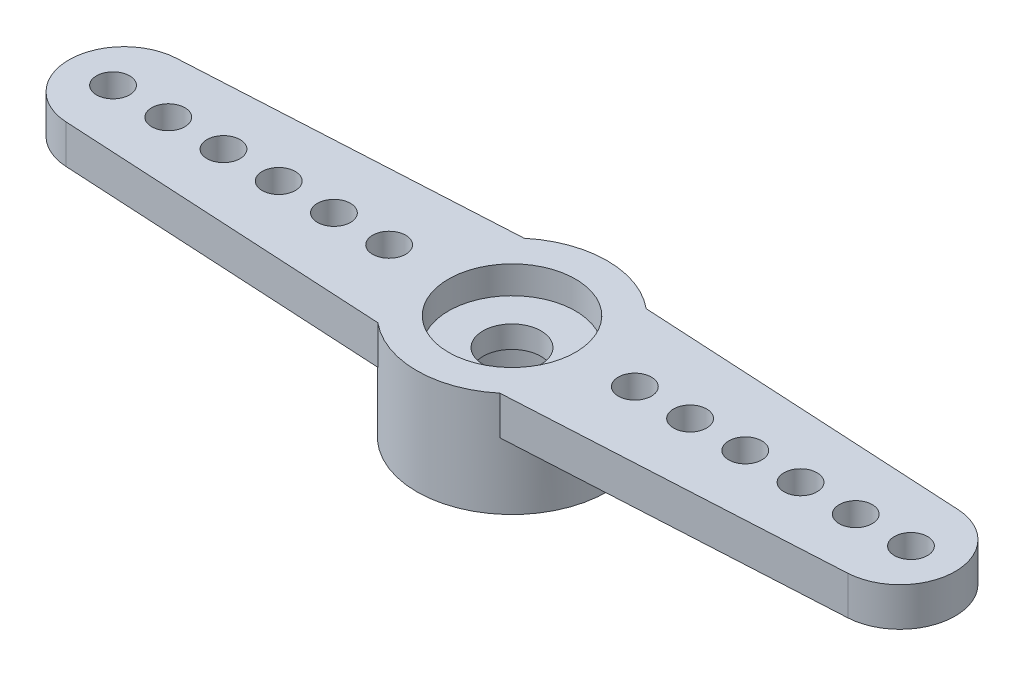
ISO-10303-21;
HEADER;
FILE_DESCRIPTION(('STEP AP214'),'2;1');
FILE_NAME('part.step','',(''),(''),'','','');
FILE_SCHEMA(('AUTOMOTIVE_DESIGN { 1 0 10303 214 1 1 1 1 }'));
ENDSEC;
DATA;
#1=APPLICATION_CONTEXT('core data for automotive mechanical design processes');
#2=APPLICATION_PROTOCOL_DEFINITION('international standard','automotive_design',2000,#1);
#3=PRODUCT_CONTEXT('',#1,'mechanical');
#4=PRODUCT('Part','Part','',(#3));
#5=PRODUCT_RELATED_PRODUCT_CATEGORY('part','',(#4));
#6=PRODUCT_DEFINITION_FORMATION('','',#4);
#7=PRODUCT_DEFINITION_CONTEXT('part definition',#1,'design');
#8=PRODUCT_DEFINITION('design','',#6,#7);
#9=PRODUCT_DEFINITION_SHAPE('','',#8);
#10=(LENGTH_UNIT() NAMED_UNIT(*) SI_UNIT(.MILLI.,.METRE.));
#11=(NAMED_UNIT(*) PLANE_ANGLE_UNIT() SI_UNIT($,.RADIAN.));
#12=(NAMED_UNIT(*) SI_UNIT($,.STERADIAN.) SOLID_ANGLE_UNIT());
#13=UNCERTAINTY_MEASURE_WITH_UNIT(LENGTH_MEASURE(1.E-05),#10,'distance_accuracy_value','');
#14=(GEOMETRIC_REPRESENTATION_CONTEXT(3) GLOBAL_UNCERTAINTY_ASSIGNED_CONTEXT((#13)) GLOBAL_UNIT_ASSIGNED_CONTEXT((#10,
#11,#12)) REPRESENTATION_CONTEXT('',''));
#15=CARTESIAN_POINT('',(0.,0.,0.));
#16=DIRECTION('',(0.,0.,1.));
#17=DIRECTION('',(1.,0.,0.));
#18=AXIS2_PLACEMENT_3D('',#15,#16,#17);
#19=CARTESIAN_POINT('',(0.,-1.4,0.));
#20=DIRECTION('',(0.,1.,0.));
#21=DIRECTION('',(0.,0.,1.));
#22=AXIS2_PLACEMENT_3D('',#19,#20,#21);
#23=PLANE('',#22);
#24=CARTESIAN_POINT('',(-12.45,-1.4,0.));
#25=DIRECTION('',(0.,1.,0.));
#26=DIRECTION('',(0.,0.,1.));
#27=AXIS2_PLACEMENT_3D('',#24,#25,#26);
#28=CIRCLE('',#27,0.600000000000014);
#29=CARTESIAN_POINT('',(-12.45,-1.4,0.600000000000014));
#30=VERTEX_POINT('',#29);
#31=EDGE_CURVE('E154',#30,#30,#28,.T.);
#32=ORIENTED_EDGE('',*,*,#31,.T.);
#33=EDGE_LOOP('',(#32));
#34=FACE_BOUND('',#33,.T.);
#35=CARTESIAN_POINT('',(-14.45,-1.4,0.));
#36=DIRECTION('',(0.,1.,0.));
#37=DIRECTION('',(0.,0.,1.));
#38=AXIS2_PLACEMENT_3D('',#35,#36,#37);
#39=CIRCLE('',#38,0.600000000000014);
#40=CARTESIAN_POINT('',(-14.45,-1.4,0.600000000000014));
#41=VERTEX_POINT('',#40);
#42=EDGE_CURVE('E167',#41,#41,#39,.T.);
#43=ORIENTED_EDGE('',*,*,#42,.T.);
#44=EDGE_LOOP('',(#43));
#45=FACE_BOUND('',#44,.T.);
#46=CARTESIAN_POINT('',(0.,-1.4,0.));
#47=DIRECTION('',(0.,-1.,0.));
#48=DIRECTION('',(0.,0.,-1.));
#49=AXIS2_PLACEMENT_3D('',#46,#47,#48);
#50=CIRCLE('',#49,3.45);
#51=CARTESIAN_POINT('',(-2.20907220343745,-1.4,2.65));
#52=VERTEX_POINT('',#51);
#53=CARTESIAN_POINT('',(-2.20907220343745,-1.4,-2.65));
#54=VERTEX_POINT('',#53);
#55=EDGE_CURVE('E94',#52,#54,#50,.T.);
#56=ORIENTED_EDGE('',*,*,#55,.F.);
#57=DIRECTION('',(0.998510440144325,0.,0.0545609835210727));
#58=VECTOR('',#57,1.);
#59=CARTESIAN_POINT('',(-2.20907220343745,-1.4,2.65));
#60=LINE('',#59,#58);
#61=CARTESIAN_POINT('',(-14.1591219670421,-1.4,1.99702088028865));
#62=VERTEX_POINT('',#61);
#63=EDGE_CURVE('E186',#62,#52,#60,.T.);
#64=ORIENTED_EDGE('',*,*,#63,.F.);
#65=CARTESIAN_POINT('',(-14.05,-1.4,0.));
#66=DIRECTION('',(0.,1.,0.));
#67=DIRECTION('',(0.,0.,1.));
#68=AXIS2_PLACEMENT_3D('',#65,#66,#67);
#69=CIRCLE('',#68,2.);
#70=CARTESIAN_POINT('',(-14.1591219670421,-1.4,-1.99702088028865));
#71=VERTEX_POINT('',#70);
#72=EDGE_CURVE('E182',#71,#62,#69,.T.);
#73=ORIENTED_EDGE('',*,*,#72,.F.);
#74=DIRECTION('',(-0.998510440144325,0.,0.0545609835210729));
#75=VECTOR('',#74,1.);
#76=CARTESIAN_POINT('',(-14.1591219670421,-1.4,-1.99702088028865));
#77=LINE('',#76,#75);
#78=EDGE_CURVE('E178',#54,#71,#77,.T.);
#79=ORIENTED_EDGE('',*,*,#78,.F.);
#80=EDGE_LOOP('',(#56,#64,#73,#79));
#81=FACE_BOUND('',#80,.T.);
#82=CARTESIAN_POINT('',(-10.45,-1.4,0.));
#83=DIRECTION('',(0.,1.,0.));
#84=DIRECTION('',(0.,0.,1.));
#85=AXIS2_PLACEMENT_3D('',#82,#83,#84);
#86=CIRCLE('',#85,0.600000000000014);
#87=CARTESIAN_POINT('',(-10.45,-1.4,0.600000000000014));
#88=VERTEX_POINT('',#87);
#89=EDGE_CURVE('E217',#88,#88,#86,.T.);
#90=ORIENTED_EDGE('',*,*,#89,.T.);
#91=EDGE_LOOP('',(#90));
#92=FACE_BOUND('',#91,.T.);
#93=CARTESIAN_POINT('',(-8.45,-1.4,0.));
#94=DIRECTION('',(0.,1.,0.));
#95=DIRECTION('',(0.,0.,1.));
#96=AXIS2_PLACEMENT_3D('',#93,#94,#95);
#97=CIRCLE('',#96,0.600000000000014);
#98=CARTESIAN_POINT('',(-8.45,-1.4,0.600000000000014));
#99=VERTEX_POINT('',#98);
#100=EDGE_CURVE('E225',#99,#99,#97,.T.);
#101=ORIENTED_EDGE('',*,*,#100,.T.);
#102=EDGE_LOOP('',(#101));
#103=FACE_BOUND('',#102,.T.);
#104=CARTESIAN_POINT('',(-6.45,-1.4,0.));
#105=DIRECTION('',(0.,1.,0.));
#106=DIRECTION('',(0.,0.,1.));
#107=AXIS2_PLACEMENT_3D('',#104,#105,#106);
#108=CIRCLE('',#107,0.600000000000014);
#109=CARTESIAN_POINT('',(-6.45,-1.4,0.600000000000014));
#110=VERTEX_POINT('',#109);
#111=EDGE_CURVE('E233',#110,#110,#108,.T.);
#112=ORIENTED_EDGE('',*,*,#111,.T.);
#113=EDGE_LOOP('',(#112));
#114=FACE_BOUND('',#113,.T.);
#115=CARTESIAN_POINT('',(-4.45,-1.4,0.));
#116=DIRECTION('',(0.,1.,0.));
#117=DIRECTION('',(0.,0.,1.));
#118=AXIS2_PLACEMENT_3D('',#115,#116,#117);
#119=CIRCLE('',#118,0.600000000000014);
#120=CARTESIAN_POINT('',(-4.45,-1.4,0.600000000000014));
#121=VERTEX_POINT('',#120);
#122=EDGE_CURVE('E12',#121,#121,#119,.T.);
#123=ORIENTED_EDGE('',*,*,#122,.T.);
#124=EDGE_LOOP('',(#123));
#125=FACE_BOUND('',#124,.T.);
#126=ADVANCED_FACE('F45',(#34,#45,#81,#92,#103,#114,#125),#23,.F.);
#127=CARTESIAN_POINT('',(0.,-1.4,0.));
#128=DIRECTION('',(0.,1.,0.));
#129=DIRECTION('',(0.,0.,1.));
#130=AXIS2_PLACEMENT_3D('',#127,#128,#129);
#131=CYLINDRICAL_SURFACE('',#130,3.45);
#132=DIRECTION('',(0.,1.,0.));
#133=VECTOR('',#132,1.);
#134=CARTESIAN_POINT('',(-2.20907220343745,-1.4,2.65));
#135=LINE('',#134,#133);
#136=CARTESIAN_POINT('',(-2.20907220343745,0.,2.65));
#137=VERTEX_POINT('',#136);
#138=EDGE_CURVE('E88',#52,#137,#135,.T.);
#139=ORIENTED_EDGE('',*,*,#138,.F.);
#140=ORIENTED_EDGE('',*,*,#55,.T.);
#141=DIRECTION('',(0.,1.,0.));
#142=VECTOR('',#141,1.);
#143=CARTESIAN_POINT('',(-2.20907220343745,-1.4,-2.65));
#144=LINE('',#143,#142);
#145=CARTESIAN_POINT('',(-2.20907220343745,0.,-2.65));
#146=VERTEX_POINT('',#145);
#147=EDGE_CURVE('E189',#54,#146,#144,.T.);
#148=ORIENTED_EDGE('',*,*,#147,.T.);
#149=CARTESIAN_POINT('',(0.,0.,0.));
#150=DIRECTION('',(0.,1.,0.));
#151=DIRECTION('',(0.,0.,1.));
#152=AXIS2_PLACEMENT_3D('',#149,#150,#151);
#153=CIRCLE('',#152,3.45);
#154=CARTESIAN_POINT('',(2.20907220343745,0.,-2.65));
#155=VERTEX_POINT('',#154);
#156=EDGE_CURVE('E177',#155,#146,#153,.T.);
#157=ORIENTED_EDGE('',*,*,#156,.F.);
#158=DIRECTION('',(0.,1.,0.));
#159=VECTOR('',#158,1.);
#160=CARTESIAN_POINT('',(2.20907220343745,-1.4,-2.65));
#161=LINE('',#160,#159);
#162=CARTESIAN_POINT('',(2.20907220343745,-1.4,-2.65));
#163=VERTEX_POINT('',#162);
#164=EDGE_CURVE('E147',#163,#155,#161,.T.);
#165=ORIENTED_EDGE('',*,*,#164,.F.);
#166=CARTESIAN_POINT('',(0.,-1.4,0.));
#167=DIRECTION('',(0.,1.,0.));
#168=DIRECTION('',(0.,0.,1.));
#169=AXIS2_PLACEMENT_3D('',#166,#167,#168);
#170=CIRCLE('',#169,3.45);
#171=CARTESIAN_POINT('',(2.20907220343745,-1.4,2.65));
#172=VERTEX_POINT('',#171);
#173=EDGE_CURVE('E137',#163,#172,#170,.F.);
#174=ORIENTED_EDGE('',*,*,#173,.T.);
#175=DIRECTION('',(0.,1.,0.));
#176=VECTOR('',#175,1.);
#177=CARTESIAN_POINT('',(2.20907220343745,-1.4,2.65));
#178=LINE('',#177,#176);
#179=CARTESIAN_POINT('',(2.20907220343745,0.,2.65));
#180=VERTEX_POINT('',#179);
#181=EDGE_CURVE('E121',#172,#180,#178,.T.);
#182=ORIENTED_EDGE('',*,*,#181,.T.);
#183=EDGE_CURVE('E190',#137,#180,#153,.T.);
#184=ORIENTED_EDGE('',*,*,#183,.F.);
#185=EDGE_LOOP('',(#139,#140,#148,#157,#165,#174,#182,#184));
#186=FACE_BOUND('',#185,.T.);
#187=CARTESIAN_POINT('',(0.,-3.8,0.));
#188=DIRECTION('',(0.,1.,0.));
#189=DIRECTION('',(0.,0.,1.));
#190=AXIS2_PLACEMENT_3D('',#187,#188,#189);
#191=CIRCLE('',#190,3.45);
#192=CARTESIAN_POINT('',(0.,-3.8,3.45));
#193=VERTEX_POINT('',#192);
#194=EDGE_CURVE('E173',#193,#193,#191,.T.);
#195=ORIENTED_EDGE('',*,*,#194,.T.);
#196=EDGE_LOOP('',(#195));
#197=FACE_BOUND('',#196,.T.);
#198=ADVANCED_FACE('F144',(#186,#197),#131,.T.);
#199=CARTESIAN_POINT('',(-2.20907220343745,-1.4,2.65));
#200=DIRECTION('',(-0.0545609835210727,0.,0.998510440144325));
#201=DIRECTION('',(0.998510440144325,0.,0.0545609835210727));
#202=AXIS2_PLACEMENT_3D('',#199,#200,#201);
#203=PLANE('',#202);
#204=DIRECTION('',(0.998510440144325,0.,0.0545609835210727));
#205=VECTOR('',#204,1.);
#206=CARTESIAN_POINT('',(-2.20907220343745,0.,2.65));
#207=LINE('',#206,#205);
#208=CARTESIAN_POINT('',(-14.1591219670421,0.,1.99702088028865));
#209=VERTEX_POINT('',#208);
#210=EDGE_CURVE('E183',#209,#137,#207,.T.);
#211=ORIENTED_EDGE('',*,*,#210,.F.);
#212=DIRECTION('',(0.,1.,0.));
#213=VECTOR('',#212,1.);
#214=CARTESIAN_POINT('',(-14.1591219670421,-1.4,1.99702088028865));
#215=LINE('',#214,#213);
#216=EDGE_CURVE('E71',#62,#209,#215,.T.);
#217=ORIENTED_EDGE('',*,*,#216,.F.);
#218=ORIENTED_EDGE('',*,*,#63,.T.);
#219=ORIENTED_EDGE('',*,*,#138,.T.);
#220=EDGE_LOOP('',(#211,#217,#218,#219));
#221=FACE_BOUND('',#220,.T.);
#222=ADVANCED_FACE('F272',(#221),#203,.T.);
#223=CARTESIAN_POINT('',(-14.05,-1.4,0.));
#224=DIRECTION('',(0.,1.,0.));
#225=DIRECTION('',(0.,0.,1.));
#226=AXIS2_PLACEMENT_3D('',#223,#224,#225);
#227=CYLINDRICAL_SURFACE('',#226,2.);
#228=CARTESIAN_POINT('',(-14.05,0.,0.));
#229=DIRECTION('',(0.,1.,0.));
#230=DIRECTION('',(0.,0.,1.));
#231=AXIS2_PLACEMENT_3D('',#228,#229,#230);
#232=CIRCLE('',#231,2.);
#233=CARTESIAN_POINT('',(-14.1591219670421,0.,-1.99702088028865));
#234=VERTEX_POINT('',#233);
#235=EDGE_CURVE('E197',#234,#209,#232,.T.);
#236=ORIENTED_EDGE('',*,*,#235,.F.);
#237=DIRECTION('',(0.,1.,0.));
#238=VECTOR('',#237,1.);
#239=CARTESIAN_POINT('',(-14.1591219670421,-1.4,-1.99702088028865));
#240=LINE('',#239,#238);
#241=EDGE_CURVE('E209',#71,#234,#240,.T.);
#242=ORIENTED_EDGE('',*,*,#241,.F.);
#243=ORIENTED_EDGE('',*,*,#72,.T.);
#244=ORIENTED_EDGE('',*,*,#216,.T.);
#245=EDGE_LOOP('',(#236,#242,#243,#244));
#246=FACE_BOUND('',#245,.T.);
#247=ADVANCED_FACE('F258',(#246),#227,.T.);
#248=CARTESIAN_POINT('',(-14.1591219670421,-1.4,-1.99702088028865));
#249=DIRECTION('',(-0.0545609835210729,0.,-0.998510440144325));
#250=DIRECTION('',(-0.998510440144325,0.,0.0545609835210729));
#251=AXIS2_PLACEMENT_3D('',#248,#249,#250);
#252=PLANE('',#251);
#253=DIRECTION('',(-0.998510440144325,0.,0.0545609835210729));
#254=VECTOR('',#253,1.);
#255=CARTESIAN_POINT('',(-14.1591219670421,0.,-1.99702088028865));
#256=LINE('',#255,#254);
#257=EDGE_CURVE('E193',#146,#234,#256,.T.);
#258=ORIENTED_EDGE('',*,*,#257,.F.);
#259=ORIENTED_EDGE('',*,*,#147,.F.);
#260=ORIENTED_EDGE('',*,*,#78,.T.);
#261=ORIENTED_EDGE('',*,*,#241,.T.);
#262=EDGE_LOOP('',(#258,#259,#260,#261));
#263=FACE_BOUND('',#262,.T.);
#264=ADVANCED_FACE('F246',(#263),#252,.T.);
#265=CARTESIAN_POINT('',(0.,0.,0.));
#266=DIRECTION('',(0.,1.,0.));
#267=DIRECTION('',(0.,0.,1.));
#268=AXIS2_PLACEMENT_3D('',#265,#266,#267);
#269=PLANE('',#268);
#270=CARTESIAN_POINT('',(0.,0.,0.));
#271=DIRECTION('',(0.,1.,0.));
#272=DIRECTION('',(0.,0.,1.));
#273=AXIS2_PLACEMENT_3D('',#270,#271,#272);
#274=CIRCLE('',#273,2.30000000000001);
#275=CARTESIAN_POINT('',(0.,0.,2.30000000000001));
#276=VERTEX_POINT('',#275);
#277=EDGE_CURVE('E345',#276,#276,#274,.T.);
#278=ORIENTED_EDGE('',*,*,#277,.F.);
#279=EDGE_LOOP('',(#278));
#280=FACE_BOUND('',#279,.T.);
#281=CARTESIAN_POINT('',(4.45,0.,0.));
#282=DIRECTION('',(0.,1.,0.));
#283=DIRECTION('',(0.,0.,1.));
#284=AXIS2_PLACEMENT_3D('',#281,#282,#283);
#285=CIRCLE('',#284,0.600000000000014);
#286=CARTESIAN_POINT('',(4.45,0.,0.600000000000014));
#287=VERTEX_POINT('',#286);
#288=EDGE_CURVE('E364',#287,#287,#285,.T.);
#289=ORIENTED_EDGE('',*,*,#288,.F.);
#290=EDGE_LOOP('',(#289));
#291=FACE_BOUND('',#290,.T.);
#292=CARTESIAN_POINT('',(6.45,0.,0.));
#293=DIRECTION('',(0.,1.,0.));
#294=DIRECTION('',(0.,0.,1.));
#295=AXIS2_PLACEMENT_3D('',#292,#293,#294);
#296=CIRCLE('',#295,0.600000000000014);
#297=CARTESIAN_POINT('',(6.45,0.,0.600000000000014));
#298=VERTEX_POINT('',#297);
#299=EDGE_CURVE('E372',#298,#298,#296,.T.);
#300=ORIENTED_EDGE('',*,*,#299,.F.);
#301=EDGE_LOOP('',(#300));
#302=FACE_BOUND('',#301,.T.);
#303=CARTESIAN_POINT('',(8.45,0.,0.));
#304=DIRECTION('',(0.,1.,0.));
#305=DIRECTION('',(0.,0.,1.));
#306=AXIS2_PLACEMENT_3D('',#303,#304,#305);
#307=CIRCLE('',#306,0.600000000000014);
#308=CARTESIAN_POINT('',(8.45,0.,0.600000000000014));
#309=VERTEX_POINT('',#308);
#310=EDGE_CURVE('E380',#309,#309,#307,.T.);
#311=ORIENTED_EDGE('',*,*,#310,.F.);
#312=EDGE_LOOP('',(#311));
#313=FACE_BOUND('',#312,.T.);
#314=CARTESIAN_POINT('',(10.45,0.,0.));
#315=DIRECTION('',(0.,1.,0.));
#316=DIRECTION('',(0.,0.,1.));
#317=AXIS2_PLACEMENT_3D('',#314,#315,#316);
#318=CIRCLE('',#317,0.600000000000014);
#319=CARTESIAN_POINT('',(10.45,0.,0.600000000000014));
#320=VERTEX_POINT('',#319);
#321=EDGE_CURVE('E388',#320,#320,#318,.T.);
#322=ORIENTED_EDGE('',*,*,#321,.F.);
#323=EDGE_LOOP('',(#322));
#324=FACE_BOUND('',#323,.T.);
#325=CARTESIAN_POINT('',(12.45,0.,0.));
#326=DIRECTION('',(0.,1.,0.));
#327=DIRECTION('',(0.,0.,1.));
#328=AXIS2_PLACEMENT_3D('',#325,#326,#327);
#329=CIRCLE('',#328,0.600000000000014);
#330=CARTESIAN_POINT('',(12.45,0.,0.600000000000014));
#331=VERTEX_POINT('',#330);
#332=EDGE_CURVE('E396',#331,#331,#329,.T.);
#333=ORIENTED_EDGE('',*,*,#332,.F.);
#334=EDGE_LOOP('',(#333));
#335=FACE_BOUND('',#334,.T.);
#336=CARTESIAN_POINT('',(14.45,0.,0.));
#337=DIRECTION('',(0.,1.,0.));
#338=DIRECTION('',(0.,0.,1.));
#339=AXIS2_PLACEMENT_3D('',#336,#337,#338);
#340=CIRCLE('',#339,0.600000000000014);
#341=CARTESIAN_POINT('',(14.45,0.,0.600000000000014));
#342=VERTEX_POINT('',#341);
#343=EDGE_CURVE('E404',#342,#342,#340,.T.);
#344=ORIENTED_EDGE('',*,*,#343,.F.);
#345=EDGE_LOOP('',(#344));
#346=FACE_BOUND('',#345,.T.);
#347=ORIENTED_EDGE('',*,*,#210,.T.);
#348=ORIENTED_EDGE('',*,*,#183,.T.);
#349=DIRECTION('',(0.998510440144325,0.,-0.0545609835210729));
#350=VECTOR('',#349,1.);
#351=CARTESIAN_POINT('',(14.1591219670421,0.,1.99702088028865));
#352=LINE('',#351,#350);
#353=CARTESIAN_POINT('',(14.1591219670421,0.,1.99702088028865));
#354=VERTEX_POINT('',#353);
#355=EDGE_CURVE('E126',#180,#354,#352,.T.);
#356=ORIENTED_EDGE('',*,*,#355,.T.);
#357=CARTESIAN_POINT('',(14.05,0.,0.));
#358=DIRECTION('',(0.,1.,0.));
#359=DIRECTION('',(0.,0.,-1.));
#360=AXIS2_PLACEMENT_3D('',#357,#358,#359);
#361=CIRCLE('',#360,2.);
#362=CARTESIAN_POINT('',(14.1591219670421,0.,-1.99702088028865));
#363=VERTEX_POINT('',#362);
#364=EDGE_CURVE('E418',#354,#363,#361,.T.);
#365=ORIENTED_EDGE('',*,*,#364,.T.);
#366=DIRECTION('',(-0.998510440144325,0.,-0.0545609835210727));
#367=VECTOR('',#366,1.);
#368=CARTESIAN_POINT('',(2.20907220343745,0.,-2.65));
#369=LINE('',#368,#367);
#370=EDGE_CURVE('E62',#363,#155,#369,.T.);
#371=ORIENTED_EDGE('',*,*,#370,.T.);
#372=ORIENTED_EDGE('',*,*,#156,.T.);
#373=ORIENTED_EDGE('',*,*,#257,.T.);
#374=ORIENTED_EDGE('',*,*,#235,.T.);
#375=EDGE_LOOP('',(#347,#348,#356,#365,#371,#372,#373,#374));
#376=FACE_BOUND('',#375,.T.);
#377=CARTESIAN_POINT('',(-12.45,0.,0.));
#378=DIRECTION('',(0.,1.,0.));
#379=DIRECTION('',(0.,0.,1.));
#380=AXIS2_PLACEMENT_3D('',#377,#378,#379);
#381=CIRCLE('',#380,0.600000000000014);
#382=CARTESIAN_POINT('',(-12.45,0.,0.600000000000014));
#383=VERTEX_POINT('',#382);
#384=EDGE_CURVE('E149',#383,#383,#381,.T.);
#385=ORIENTED_EDGE('',*,*,#384,.F.);
#386=EDGE_LOOP('',(#385));
#387=FACE_BOUND('',#386,.T.);
#388=CARTESIAN_POINT('',(-14.45,0.,0.));
#389=DIRECTION('',(0.,1.,0.));
#390=DIRECTION('',(0.,0.,1.));
#391=AXIS2_PLACEMENT_3D('',#388,#389,#390);
#392=CIRCLE('',#391,0.600000000000014);
#393=CARTESIAN_POINT('',(-14.45,0.,0.600000000000014));
#394=VERTEX_POINT('',#393);
#395=EDGE_CURVE('E163',#394,#394,#392,.T.);
#396=ORIENTED_EDGE('',*,*,#395,.F.);
#397=EDGE_LOOP('',(#396));
#398=FACE_BOUND('',#397,.T.);
#399=CARTESIAN_POINT('',(-10.45,0.,0.));
#400=DIRECTION('',(0.,1.,0.));
#401=DIRECTION('',(0.,0.,1.));
#402=AXIS2_PLACEMENT_3D('',#399,#400,#401);
#403=CIRCLE('',#402,0.600000000000014);
#404=CARTESIAN_POINT('',(-10.45,0.,0.600000000000014));
#405=VERTEX_POINT('',#404);
#406=EDGE_CURVE('E206',#405,#405,#403,.T.);
#407=ORIENTED_EDGE('',*,*,#406,.F.);
#408=EDGE_LOOP('',(#407));
#409=FACE_BOUND('',#408,.T.);
#410=CARTESIAN_POINT('',(-8.45,0.,0.));
#411=DIRECTION('',(0.,1.,0.));
#412=DIRECTION('',(0.,0.,1.));
#413=AXIS2_PLACEMENT_3D('',#410,#411,#412);
#414=CIRCLE('',#413,0.600000000000014);
#415=CARTESIAN_POINT('',(-8.45,0.,0.600000000000014));
#416=VERTEX_POINT('',#415);
#417=EDGE_CURVE('E221',#416,#416,#414,.T.);
#418=ORIENTED_EDGE('',*,*,#417,.F.);
#419=EDGE_LOOP('',(#418));
#420=FACE_BOUND('',#419,.T.);
#421=CARTESIAN_POINT('',(-6.45,0.,0.));
#422=DIRECTION('',(0.,1.,0.));
#423=DIRECTION('',(0.,0.,1.));
#424=AXIS2_PLACEMENT_3D('',#421,#422,#423);
#425=CIRCLE('',#424,0.600000000000014);
#426=CARTESIAN_POINT('',(-6.45,0.,0.600000000000014));
#427=VERTEX_POINT('',#426);
#428=EDGE_CURVE('E229',#427,#427,#425,.T.);
#429=ORIENTED_EDGE('',*,*,#428,.F.);
#430=EDGE_LOOP('',(#429));
#431=FACE_BOUND('',#430,.T.);
#432=CARTESIAN_POINT('',(-4.45,0.,0.));
#433=DIRECTION('',(0.,1.,0.));
#434=DIRECTION('',(0.,0.,1.));
#435=AXIS2_PLACEMENT_3D('',#432,#433,#434);
#436=CIRCLE('',#435,0.600000000000014);
#437=CARTESIAN_POINT('',(-4.45,0.,0.600000000000014));
#438=VERTEX_POINT('',#437);
#439=EDGE_CURVE('E55',#438,#438,#436,.T.);
#440=ORIENTED_EDGE('',*,*,#439,.F.);
#441=EDGE_LOOP('',(#440));
#442=FACE_BOUND('',#441,.T.);
#443=ADVANCED_FACE('F243',(#280,#291,#302,#313,#324,#335,#346,#376,#387,#398,#409,#420,#431,
#442),#269,.T.);
#444=CARTESIAN_POINT('',(0.,-3.8,0.));
#445=DIRECTION('',(0.,1.,0.));
#446=DIRECTION('',(0.,0.,1.));
#447=AXIS2_PLACEMENT_3D('',#444,#445,#446);
#448=PLANE('',#447);
#449=CARTESIAN_POINT('',(0.,-3.8,0.));
#450=DIRECTION('',(0.,-1.,0.));
#451=DIRECTION('',(0.,0.,-1.));
#452=AXIS2_PLACEMENT_3D('',#449,#450,#451);
#453=CIRCLE('',#452,2.47500000000001);
#454=CARTESIAN_POINT('',(0.,-3.8,-2.47500000000001));
#455=VERTEX_POINT('',#454);
#456=EDGE_CURVE('E356',#455,#455,#453,.T.);
#457=ORIENTED_EDGE('',*,*,#456,.F.);
#458=EDGE_LOOP('',(#457));
#459=FACE_BOUND('',#458,.T.);
#460=ORIENTED_EDGE('',*,*,#194,.F.);
#461=EDGE_LOOP('',(#460));
#462=FACE_BOUND('',#461,.T.);
#463=ADVANCED_FACE('F245',(#459,#462),#448,.F.);
#464=CARTESIAN_POINT('',(-14.45,0.,0.));
#465=DIRECTION('',(0.,1.,0.));
#466=DIRECTION('',(0.,0.,1.));
#467=AXIS2_PLACEMENT_3D('',#464,#465,#466);
#468=CYLINDRICAL_SURFACE('',#467,0.600000000000014);
#469=ORIENTED_EDGE('',*,*,#395,.T.);
#470=EDGE_LOOP('',(#469));
#471=FACE_BOUND('',#470,.T.);
#472=ORIENTED_EDGE('',*,*,#42,.F.);
#473=EDGE_LOOP('',(#472));
#474=FACE_BOUND('',#473,.T.);
#475=ADVANCED_FACE('F254',(#471,#474),#468,.F.);
#476=CARTESIAN_POINT('',(-12.45,0.,0.));
#477=DIRECTION('',(0.,1.,0.));
#478=DIRECTION('',(0.,0.,1.));
#479=AXIS2_PLACEMENT_3D('',#476,#477,#478);
#480=CYLINDRICAL_SURFACE('',#479,0.600000000000014);
#481=ORIENTED_EDGE('',*,*,#384,.T.);
#482=EDGE_LOOP('',(#481));
#483=FACE_BOUND('',#482,.T.);
#484=ORIENTED_EDGE('',*,*,#31,.F.);
#485=EDGE_LOOP('',(#484));
#486=FACE_BOUND('',#485,.T.);
#487=ADVANCED_FACE('F277',(#483,#486),#480,.F.);
#488=CARTESIAN_POINT('',(-10.45,0.,0.));
#489=DIRECTION('',(0.,1.,0.));
#490=DIRECTION('',(0.,0.,1.));
#491=AXIS2_PLACEMENT_3D('',#488,#489,#490);
#492=CYLINDRICAL_SURFACE('',#491,0.600000000000014);
#493=ORIENTED_EDGE('',*,*,#406,.T.);
#494=EDGE_LOOP('',(#493));
#495=FACE_BOUND('',#494,.T.);
#496=ORIENTED_EDGE('',*,*,#89,.F.);
#497=EDGE_LOOP('',(#496));
#498=FACE_BOUND('',#497,.T.);
#499=ADVANCED_FACE('F280',(#495,#498),#492,.F.);
#500=CARTESIAN_POINT('',(-8.45,0.,0.));
#501=DIRECTION('',(0.,1.,0.));
#502=DIRECTION('',(0.,0.,1.));
#503=AXIS2_PLACEMENT_3D('',#500,#501,#502);
#504=CYLINDRICAL_SURFACE('',#503,0.600000000000014);
#505=ORIENTED_EDGE('',*,*,#417,.T.);
#506=EDGE_LOOP('',(#505));
#507=FACE_BOUND('',#506,.T.);
#508=ORIENTED_EDGE('',*,*,#100,.F.);
#509=EDGE_LOOP('',(#508));
#510=FACE_BOUND('',#509,.T.);
#511=ADVANCED_FACE('F446',(#507,#510),#504,.F.);
#512=CARTESIAN_POINT('',(-6.45,0.,0.));
#513=DIRECTION('',(0.,1.,0.));
#514=DIRECTION('',(0.,0.,1.));
#515=AXIS2_PLACEMENT_3D('',#512,#513,#514);
#516=CYLINDRICAL_SURFACE('',#515,0.600000000000014);
#517=ORIENTED_EDGE('',*,*,#428,.T.);
#518=EDGE_LOOP('',(#517));
#519=FACE_BOUND('',#518,.T.);
#520=ORIENTED_EDGE('',*,*,#111,.F.);
#521=EDGE_LOOP('',(#520));
#522=FACE_BOUND('',#521,.T.);
#523=ADVANCED_FACE('F449',(#519,#522),#516,.F.);
#524=CARTESIAN_POINT('',(-4.45,0.,0.));
#525=DIRECTION('',(0.,1.,0.));
#526=DIRECTION('',(0.,0.,1.));
#527=AXIS2_PLACEMENT_3D('',#524,#525,#526);
#528=CYLINDRICAL_SURFACE('',#527,0.600000000000014);
#529=ORIENTED_EDGE('',*,*,#439,.T.);
#530=EDGE_LOOP('',(#529));
#531=FACE_BOUND('',#530,.T.);
#532=ORIENTED_EDGE('',*,*,#122,.F.);
#533=EDGE_LOOP('',(#532));
#534=FACE_BOUND('',#533,.T.);
#535=ADVANCED_FACE('F47',(#531,#534),#528,.F.);
#536=CARTESIAN_POINT('',(2.20907220343745,-1.4,-2.65));
#537=DIRECTION('',(0.0545609835210727,0.,-0.998510440144325));
#538=DIRECTION('',(-0.998510440144325,0.,-0.0545609835210727));
#539=AXIS2_PLACEMENT_3D('',#536,#537,#538);
#540=PLANE('',#539);
#541=ORIENTED_EDGE('',*,*,#370,.F.);
#542=DIRECTION('',(0.,1.,0.));
#543=VECTOR('',#542,1.);
#544=CARTESIAN_POINT('',(14.1591219670421,-1.4,-1.99702088028865));
#545=LINE('',#544,#543);
#546=CARTESIAN_POINT('',(14.1591219670421,-1.4,-1.99702088028865));
#547=VERTEX_POINT('',#546);
#548=EDGE_CURVE('E156',#547,#363,#545,.T.);
#549=ORIENTED_EDGE('',*,*,#548,.F.);
#550=DIRECTION('',(-0.998510440144325,0.,-0.0545609835210727));
#551=VECTOR('',#550,1.);
#552=CARTESIAN_POINT('',(2.20907220343745,-1.4,-2.65));
#553=LINE('',#552,#551);
#554=EDGE_CURVE('E131',#547,#163,#553,.T.);
#555=ORIENTED_EDGE('',*,*,#554,.T.);
#556=ORIENTED_EDGE('',*,*,#164,.T.);
#557=EDGE_LOOP('',(#541,#549,#555,#556));
#558=FACE_BOUND('',#557,.T.);
#559=ADVANCED_FACE('F287',(#558),#540,.T.);
#560=CARTESIAN_POINT('',(14.05,-1.4,0.));
#561=DIRECTION('',(0.,1.,0.));
#562=DIRECTION('',(0.,0.,1.));
#563=AXIS2_PLACEMENT_3D('',#560,#561,#562);
#564=CYLINDRICAL_SURFACE('',#563,2.);
#565=ORIENTED_EDGE('',*,*,#364,.F.);
#566=DIRECTION('',(0.,1.,0.));
#567=VECTOR('',#566,1.);
#568=CARTESIAN_POINT('',(14.1591219670421,-1.4,1.99702088028865));
#569=LINE('',#568,#567);
#570=CARTESIAN_POINT('',(14.1591219670421,-1.4,1.99702088028865));
#571=VERTEX_POINT('',#570);
#572=EDGE_CURVE('E130',#571,#354,#569,.T.);
#573=ORIENTED_EDGE('',*,*,#572,.F.);
#574=CARTESIAN_POINT('',(14.05,-1.4,0.));
#575=DIRECTION('',(0.,1.,0.));
#576=DIRECTION('',(0.,0.,-1.));
#577=AXIS2_PLACEMENT_3D('',#574,#575,#576);
#578=CIRCLE('',#577,2.);
#579=EDGE_CURVE('E140',#571,#547,#578,.T.);
#580=ORIENTED_EDGE('',*,*,#579,.T.);
#581=ORIENTED_EDGE('',*,*,#548,.T.);
#582=EDGE_LOOP('',(#565,#573,#580,#581));
#583=FACE_BOUND('',#582,.T.);
#584=ADVANCED_FACE('F284',(#583),#564,.T.);
#585=CARTESIAN_POINT('',(14.1591219670421,-1.4,1.99702088028865));
#586=DIRECTION('',(0.0545609835210729,0.,0.998510440144325));
#587=DIRECTION('',(0.998510440144325,0.,-0.0545609835210729));
#588=AXIS2_PLACEMENT_3D('',#585,#586,#587);
#589=PLANE('',#588);
#590=ORIENTED_EDGE('',*,*,#355,.F.);
#591=ORIENTED_EDGE('',*,*,#181,.F.);
#592=DIRECTION('',(0.998510440144325,0.,-0.0545609835210729));
#593=VECTOR('',#592,1.);
#594=CARTESIAN_POINT('',(14.1591219670421,-1.4,1.99702088028865));
#595=LINE('',#594,#593);
#596=EDGE_CURVE('E124',#172,#571,#595,.T.);
#597=ORIENTED_EDGE('',*,*,#596,.T.);
#598=ORIENTED_EDGE('',*,*,#572,.T.);
#599=EDGE_LOOP('',(#590,#591,#597,#598));
#600=FACE_BOUND('',#599,.T.);
#601=ADVANCED_FACE('F123',(#600),#589,.T.);
#602=CARTESIAN_POINT('',(0.,-1.4,0.));
#603=DIRECTION('',(0.,1.,0.));
#604=DIRECTION('',(0.,0.,-1.));
#605=AXIS2_PLACEMENT_3D('',#602,#603,#604);
#606=PLANE('',#605);
#607=CARTESIAN_POINT('',(4.45,-1.4,0.));
#608=DIRECTION('',(0.,1.,0.));
#609=DIRECTION('',(0.,0.,1.));
#610=AXIS2_PLACEMENT_3D('',#607,#608,#609);
#611=CIRCLE('',#610,0.600000000000013);
#612=CARTESIAN_POINT('',(4.45,-1.4,0.600000000000013));
#613=VERTEX_POINT('',#612);
#614=EDGE_CURVE('E368',#613,#613,#611,.T.);
#615=ORIENTED_EDGE('',*,*,#614,.T.);
#616=EDGE_LOOP('',(#615));
#617=FACE_BOUND('',#616,.T.);
#618=CARTESIAN_POINT('',(6.45,-1.4,0.));
#619=DIRECTION('',(0.,1.,0.));
#620=DIRECTION('',(0.,0.,1.));
#621=AXIS2_PLACEMENT_3D('',#618,#619,#620);
#622=CIRCLE('',#621,0.600000000000013);
#623=CARTESIAN_POINT('',(6.45,-1.4,0.600000000000013));
#624=VERTEX_POINT('',#623);
#625=EDGE_CURVE('E376',#624,#624,#622,.T.);
#626=ORIENTED_EDGE('',*,*,#625,.T.);
#627=EDGE_LOOP('',(#626));
#628=FACE_BOUND('',#627,.T.);
#629=CARTESIAN_POINT('',(8.45,-1.4,0.));
#630=DIRECTION('',(0.,1.,0.));
#631=DIRECTION('',(0.,0.,1.));
#632=AXIS2_PLACEMENT_3D('',#629,#630,#631);
#633=CIRCLE('',#632,0.600000000000014);
#634=CARTESIAN_POINT('',(8.45,-1.4,0.600000000000014));
#635=VERTEX_POINT('',#634);
#636=EDGE_CURVE('E384',#635,#635,#633,.T.);
#637=ORIENTED_EDGE('',*,*,#636,.T.);
#638=EDGE_LOOP('',(#637));
#639=FACE_BOUND('',#638,.T.);
#640=CARTESIAN_POINT('',(10.45,-1.4,0.));
#641=DIRECTION('',(0.,1.,0.));
#642=DIRECTION('',(0.,0.,1.));
#643=AXIS2_PLACEMENT_3D('',#640,#641,#642);
#644=CIRCLE('',#643,0.600000000000014);
#645=CARTESIAN_POINT('',(10.45,-1.4,0.600000000000014));
#646=VERTEX_POINT('',#645);
#647=EDGE_CURVE('E392',#646,#646,#644,.T.);
#648=ORIENTED_EDGE('',*,*,#647,.T.);
#649=EDGE_LOOP('',(#648));
#650=FACE_BOUND('',#649,.T.);
#651=CARTESIAN_POINT('',(12.45,-1.4,0.));
#652=DIRECTION('',(0.,1.,0.));
#653=DIRECTION('',(0.,0.,1.));
#654=AXIS2_PLACEMENT_3D('',#651,#652,#653);
#655=CIRCLE('',#654,0.600000000000014);
#656=CARTESIAN_POINT('',(12.45,-1.4,0.600000000000014));
#657=VERTEX_POINT('',#656);
#658=EDGE_CURVE('E400',#657,#657,#655,.T.);
#659=ORIENTED_EDGE('',*,*,#658,.T.);
#660=EDGE_LOOP('',(#659));
#661=FACE_BOUND('',#660,.T.);
#662=CARTESIAN_POINT('',(14.45,-1.4,0.));
#663=DIRECTION('',(0.,1.,0.));
#664=DIRECTION('',(0.,0.,1.));
#665=AXIS2_PLACEMENT_3D('',#662,#663,#664);
#666=CIRCLE('',#665,0.600000000000014);
#667=CARTESIAN_POINT('',(14.45,-1.4,0.600000000000014));
#668=VERTEX_POINT('',#667);
#669=EDGE_CURVE('E408',#668,#668,#666,.T.);
#670=ORIENTED_EDGE('',*,*,#669,.T.);
#671=EDGE_LOOP('',(#670));
#672=FACE_BOUND('',#671,.T.);
#673=ORIENTED_EDGE('',*,*,#173,.F.);
#674=ORIENTED_EDGE('',*,*,#554,.F.);
#675=ORIENTED_EDGE('',*,*,#579,.F.);
#676=ORIENTED_EDGE('',*,*,#596,.F.);
#677=EDGE_LOOP('',(#673,#674,#675,#676));
#678=FACE_BOUND('',#677,.T.);
#679=ADVANCED_FACE('F135',(#617,#628,#639,#650,#661,#672,#678),#606,.F.);
#680=CARTESIAN_POINT('',(14.45,0.,0.));
#681=DIRECTION('',(0.,1.,0.));
#682=DIRECTION('',(0.,0.,1.));
#683=AXIS2_PLACEMENT_3D('',#680,#681,#682);
#684=CYLINDRICAL_SURFACE('',#683,0.600000000000014);
#685=ORIENTED_EDGE('',*,*,#343,.T.);
#686=EDGE_LOOP('',(#685));
#687=FACE_BOUND('',#686,.T.);
#688=ORIENTED_EDGE('',*,*,#669,.F.);
#689=EDGE_LOOP('',(#688));
#690=FACE_BOUND('',#689,.T.);
#691=ADVANCED_FACE('F294',(#687,#690),#684,.F.);
#692=CARTESIAN_POINT('',(12.45,0.,0.));
#693=DIRECTION('',(0.,1.,0.));
#694=DIRECTION('',(0.,0.,1.));
#695=AXIS2_PLACEMENT_3D('',#692,#693,#694);
#696=CYLINDRICAL_SURFACE('',#695,0.600000000000014);
#697=ORIENTED_EDGE('',*,*,#332,.T.);
#698=EDGE_LOOP('',(#697));
#699=FACE_BOUND('',#698,.T.);
#700=ORIENTED_EDGE('',*,*,#658,.F.);
#701=EDGE_LOOP('',(#700));
#702=FACE_BOUND('',#701,.T.);
#703=ADVANCED_FACE('F298',(#699,#702),#696,.F.);
#704=CARTESIAN_POINT('',(10.45,0.,0.));
#705=DIRECTION('',(0.,1.,0.));
#706=DIRECTION('',(0.,0.,1.));
#707=AXIS2_PLACEMENT_3D('',#704,#705,#706);
#708=CYLINDRICAL_SURFACE('',#707,0.600000000000014);
#709=ORIENTED_EDGE('',*,*,#321,.T.);
#710=EDGE_LOOP('',(#709));
#711=FACE_BOUND('',#710,.T.);
#712=ORIENTED_EDGE('',*,*,#647,.F.);
#713=EDGE_LOOP('',(#712));
#714=FACE_BOUND('',#713,.T.);
#715=ADVANCED_FACE('F302',(#711,#714),#708,.F.);
#716=CARTESIAN_POINT('',(8.45,0.,0.));
#717=DIRECTION('',(0.,1.,0.));
#718=DIRECTION('',(0.,0.,1.));
#719=AXIS2_PLACEMENT_3D('',#716,#717,#718);
#720=CYLINDRICAL_SURFACE('',#719,0.600000000000014);
#721=ORIENTED_EDGE('',*,*,#310,.T.);
#722=EDGE_LOOP('',(#721));
#723=FACE_BOUND('',#722,.T.);
#724=ORIENTED_EDGE('',*,*,#636,.F.);
#725=EDGE_LOOP('',(#724));
#726=FACE_BOUND('',#725,.T.);
#727=ADVANCED_FACE('F306',(#723,#726),#720,.F.);
#728=CARTESIAN_POINT('',(6.45,0.,0.));
#729=DIRECTION('',(0.,1.,0.));
#730=DIRECTION('',(0.,0.,1.));
#731=AXIS2_PLACEMENT_3D('',#728,#729,#730);
#732=CYLINDRICAL_SURFACE('',#731,0.600000000000013);
#733=ORIENTED_EDGE('',*,*,#299,.T.);
#734=EDGE_LOOP('',(#733));
#735=FACE_BOUND('',#734,.T.);
#736=ORIENTED_EDGE('',*,*,#625,.F.);
#737=EDGE_LOOP('',(#736));
#738=FACE_BOUND('',#737,.T.);
#739=ADVANCED_FACE('F310',(#735,#738),#732,.F.);
#740=CARTESIAN_POINT('',(4.45,0.,0.));
#741=DIRECTION('',(0.,1.,0.));
#742=DIRECTION('',(0.,0.,1.));
#743=AXIS2_PLACEMENT_3D('',#740,#741,#742);
#744=CYLINDRICAL_SURFACE('',#743,0.600000000000013);
#745=ORIENTED_EDGE('',*,*,#288,.T.);
#746=EDGE_LOOP('',(#745));
#747=FACE_BOUND('',#746,.T.);
#748=ORIENTED_EDGE('',*,*,#614,.F.);
#749=EDGE_LOOP('',(#748));
#750=FACE_BOUND('',#749,.T.);
#751=ADVANCED_FACE('F314',(#747,#750),#744,.F.);
#752=CARTESIAN_POINT('',(0.,-1.8,0.));
#753=DIRECTION('',(0.,1.,0.));
#754=DIRECTION('',(0.,0.,1.));
#755=AXIS2_PLACEMENT_3D('',#752,#753,#754);
#756=PLANE('',#755);
#757=CARTESIAN_POINT('',(0.,-1.8,0.));
#758=DIRECTION('',(0.,1.,0.));
#759=DIRECTION('',(0.,0.,1.));
#760=AXIS2_PLACEMENT_3D('',#757,#758,#759);
#761=CIRCLE('',#760,1.05000000000001);
#762=CARTESIAN_POINT('',(0.,-1.8,1.05000000000001));
#763=VERTEX_POINT('',#762);
#764=EDGE_CURVE('E343',#763,#763,#761,.T.);
#765=ORIENTED_EDGE('',*,*,#764,.T.);
#766=EDGE_LOOP('',(#765));
#767=FACE_BOUND('',#766,.T.);
#768=CARTESIAN_POINT('',(0.,-1.8,0.));
#769=DIRECTION('',(0.,-1.,0.));
#770=DIRECTION('',(0.,0.,-1.));
#771=AXIS2_PLACEMENT_3D('',#768,#769,#770);
#772=CIRCLE('',#771,2.47500000000001);
#773=CARTESIAN_POINT('',(0.,-1.8,-2.47500000000001));
#774=VERTEX_POINT('',#773);
#775=EDGE_CURVE('E360',#774,#774,#772,.T.);
#776=ORIENTED_EDGE('',*,*,#775,.T.);
#777=EDGE_LOOP('',(#776));
#778=FACE_BOUND('',#777,.T.);
#779=ADVANCED_FACE('F318',(#767,#778),#756,.F.);
#780=CARTESIAN_POINT('',(0.,-3.8,0.));
#781=DIRECTION('',(0.,-1.,0.));
#782=DIRECTION('',(0.,0.,-1.));
#783=AXIS2_PLACEMENT_3D('',#780,#781,#782);
#784=CYLINDRICAL_SURFACE('',#783,2.47500000000001);
#785=ORIENTED_EDGE('',*,*,#775,.F.);
#786=EDGE_LOOP('',(#785));
#787=FACE_BOUND('',#786,.T.);
#788=ORIENTED_EDGE('',*,*,#456,.T.);
#789=EDGE_LOOP('',(#788));
#790=FACE_BOUND('',#789,.T.);
#791=ADVANCED_FACE('F322',(#787,#790),#784,.F.);
#792=CARTESIAN_POINT('',(0.,-1.,0.));
#793=DIRECTION('',(0.,-1.,0.));
#794=DIRECTION('',(0.,0.,-1.));
#795=AXIS2_PLACEMENT_3D('',#792,#793,#794);
#796=PLANE('',#795);
#797=CARTESIAN_POINT('',(0.,-1.,0.));
#798=DIRECTION('',(0.,-1.,0.));
#799=DIRECTION('',(0.,0.,-1.));
#800=AXIS2_PLACEMENT_3D('',#797,#798,#799);
#801=CIRCLE('',#800,1.05000000000001);
#802=CARTESIAN_POINT('',(0.,-1.,-1.05000000000001));
#803=VERTEX_POINT('',#802);
#804=EDGE_CURVE('E49',#803,#803,#801,.T.);
#805=ORIENTED_EDGE('',*,*,#804,.T.);
#806=EDGE_LOOP('',(#805));
#807=FACE_BOUND('',#806,.T.);
#808=CARTESIAN_POINT('',(0.,-1.,0.));
#809=DIRECTION('',(0.,1.,0.));
#810=DIRECTION('',(0.,0.,1.));
#811=AXIS2_PLACEMENT_3D('',#808,#809,#810);
#812=CIRCLE('',#811,2.30000000000001);
#813=CARTESIAN_POINT('',(0.,-1.,2.30000000000001));
#814=VERTEX_POINT('',#813);
#815=EDGE_CURVE('E350',#814,#814,#812,.T.);
#816=ORIENTED_EDGE('',*,*,#815,.T.);
#817=EDGE_LOOP('',(#816));
#818=FACE_BOUND('',#817,.T.);
#819=ADVANCED_FACE('F325',(#807,#818),#796,.F.);
#820=CARTESIAN_POINT('',(0.,0.,0.));
#821=DIRECTION('',(0.,1.,0.));
#822=DIRECTION('',(0.,0.,1.));
#823=AXIS2_PLACEMENT_3D('',#820,#821,#822);
#824=CYLINDRICAL_SURFACE('',#823,2.30000000000001);
#825=ORIENTED_EDGE('',*,*,#815,.F.);
#826=EDGE_LOOP('',(#825));
#827=FACE_BOUND('',#826,.T.);
#828=ORIENTED_EDGE('',*,*,#277,.T.);
#829=EDGE_LOOP('',(#828));
#830=FACE_BOUND('',#829,.T.);
#831=ADVANCED_FACE('F329',(#827,#830),#824,.F.);
#832=CARTESIAN_POINT('',(0.,0.,0.));
#833=DIRECTION('',(0.,1.,0.));
#834=DIRECTION('',(0.,0.,1.));
#835=AXIS2_PLACEMENT_3D('',#832,#833,#834);
#836=CYLINDRICAL_SURFACE('',#835,1.05000000000001);
#837=ORIENTED_EDGE('',*,*,#804,.F.);
#838=EDGE_LOOP('',(#837));
#839=FACE_BOUND('',#838,.T.);
#840=ORIENTED_EDGE('',*,*,#764,.F.);
#841=EDGE_LOOP('',(#840));
#842=FACE_BOUND('',#841,.T.);
#843=ADVANCED_FACE('F332',(#839,#842),#836,.F.);
#844=CLOSED_SHELL('',(#126,#198,#222,#247,#264,#443,#463,#475,#487,#499,#511,#523,#535,#559,
#584,#601,#679,#691,#703,#715,#727,#739,#751,#779,#791,#819,#831,#843));
#845=MANIFOLD_SOLID_BREP('B2',#844);
#846=ADVANCED_BREP_SHAPE_REPRESENTATION('',(#18,#845),#14);
#847=SHAPE_DEFINITION_REPRESENTATION(#9,#846);
ENDSEC;
END-ISO-10303-21;
